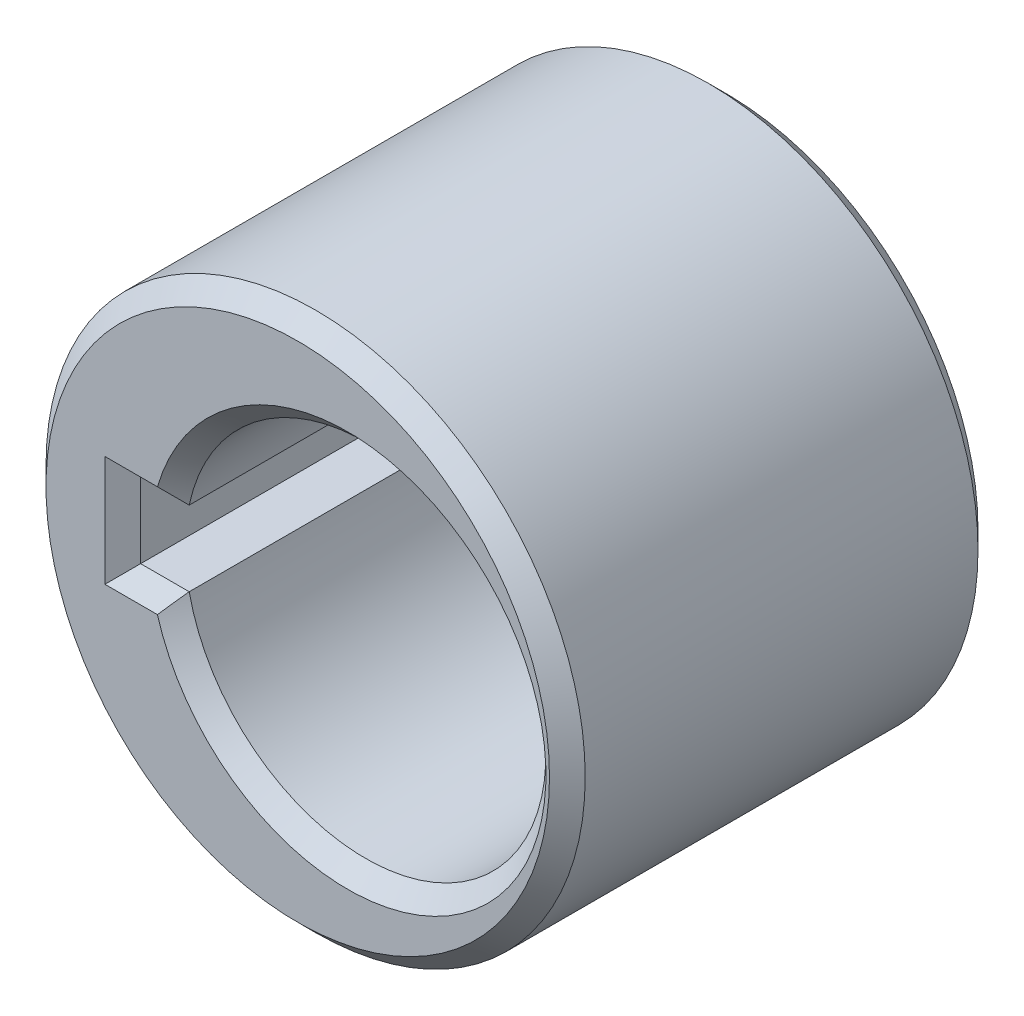
ISO-10303-21;
HEADER;
FILE_DESCRIPTION(('STEP AP214'),'2;1');
FILE_NAME('part.step','',(''),(''),'','','');
FILE_SCHEMA(('AUTOMOTIVE_DESIGN { 1 0 10303 214 1 1 1 1 }'));
ENDSEC;
DATA;
#1=APPLICATION_CONTEXT('core data for automotive mechanical design processes');
#2=APPLICATION_PROTOCOL_DEFINITION('international standard','automotive_design',2000,#1);
#3=PRODUCT_CONTEXT('',#1,'mechanical');
#4=PRODUCT('Part','Part','',(#3));
#5=PRODUCT_RELATED_PRODUCT_CATEGORY('part','',(#4));
#6=PRODUCT_DEFINITION_FORMATION('','',#4);
#7=PRODUCT_DEFINITION_CONTEXT('part definition',#1,'design');
#8=PRODUCT_DEFINITION('design','',#6,#7);
#9=PRODUCT_DEFINITION_SHAPE('','',#8);
#10=(LENGTH_UNIT() NAMED_UNIT(*) SI_UNIT(.MILLI.,.METRE.));
#11=(NAMED_UNIT(*) PLANE_ANGLE_UNIT() SI_UNIT($,.RADIAN.));
#12=(NAMED_UNIT(*) SI_UNIT($,.STERADIAN.) SOLID_ANGLE_UNIT());
#13=UNCERTAINTY_MEASURE_WITH_UNIT(LENGTH_MEASURE(1.E-05),#10,'distance_accuracy_value','');
#14=(GEOMETRIC_REPRESENTATION_CONTEXT(3) GLOBAL_UNCERTAINTY_ASSIGNED_CONTEXT((#13)) GLOBAL_UNIT_ASSIGNED_CONTEXT((#10,
#11,#12)) REPRESENTATION_CONTEXT('',''));
#15=CARTESIAN_POINT('',(0.,0.,0.));
#16=DIRECTION('',(0.,0.,1.));
#17=DIRECTION('',(1.,0.,0.));
#18=AXIS2_PLACEMENT_3D('',#15,#16,#17);
#19=CARTESIAN_POINT('',(-1.4,0.,12.));
#20=DIRECTION('',(0.,0.,1.));
#21=DIRECTION('',(1.,0.,0.));
#22=AXIS2_PLACEMENT_3D('',#19,#20,#21);
#23=PLANE('',#22);
#24=CARTESIAN_POINT('',(-1.4,0.,12.));
#25=DIRECTION('',(0.,0.,1.));
#26=DIRECTION('',(1.,0.,0.));
#27=AXIS2_PLACEMENT_3D('',#24,#25,#26);
#28=CIRCLE('',#27,7.05);
#29=CARTESIAN_POINT('',(5.65,0.,12.));
#30=VERTEX_POINT('',#29);
#31=EDGE_CURVE('E11',#30,#30,#28,.T.);
#32=ORIENTED_EDGE('',*,*,#31,.T.);
#33=EDGE_LOOP('',(#32));
#34=FACE_BOUND('',#33,.T.);
#35=DIRECTION('',(-1.,0.,0.));
#36=VECTOR('',#35,1.);
#37=CARTESIAN_POINT('',(-6.3,-1.55,12.));
#38=LINE('',#37,#36);
#39=CARTESIAN_POINT('',(-5.32916503778969,-1.54999999999999,12.));
#40=VERTEX_POINT('',#39);
#41=CARTESIAN_POINT('',(-6.79999999999999,-1.55,12.));
#42=VERTEX_POINT('',#41);
#43=EDGE_CURVE('E141',#40,#42,#38,.T.);
#44=ORIENTED_EDGE('',*,*,#43,.T.);
#45=DIRECTION('',(0.,1.,0.));
#46=VECTOR('',#45,1.);
#47=CARTESIAN_POINT('',(-6.79999999999999,1.05,12.));
#48=LINE('',#47,#46);
#49=CARTESIAN_POINT('',(-6.79999999999999,1.54999999999999,12.));
#50=VERTEX_POINT('',#49);
#51=EDGE_CURVE('E123',#42,#50,#48,.T.);
#52=ORIENTED_EDGE('',*,*,#51,.T.);
#53=DIRECTION('',(1.,0.,0.));
#54=VECTOR('',#53,1.);
#55=CARTESIAN_POINT('',(-4.93963561409139,1.54999999999999,12.));
#56=LINE('',#55,#54);
#57=CARTESIAN_POINT('',(-5.32916503778969,1.54999999999999,12.));
#58=VERTEX_POINT('',#57);
#59=EDGE_CURVE('E147',#50,#58,#56,.T.);
#60=ORIENTED_EDGE('',*,*,#59,.T.);
#61=CARTESIAN_POINT('',(0.,0.,12.));
#62=DIRECTION('',(0.,0.,1.));
#63=DIRECTION('',(1.,0.,0.));
#64=AXIS2_PLACEMENT_3D('',#61,#62,#63);
#65=CIRCLE('',#64,5.54999999999999);
#66=EDGE_CURVE('E138',#58,#40,#65,.F.);
#67=ORIENTED_EDGE('',*,*,#66,.T.);
#68=EDGE_LOOP('',(#44,#52,#60,#67));
#69=FACE_BOUND('',#68,.T.);
#70=ADVANCED_FACE('F41',(#34,#69),#23,.T.);
#71=CARTESIAN_POINT('',(-1.4,0.,0.));
#72=DIRECTION('',(0.,0.,1.));
#73=DIRECTION('',(1.,0.,0.));
#74=AXIS2_PLACEMENT_3D('',#71,#72,#73);
#75=PLANE('',#74);
#76=CARTESIAN_POINT('',(-1.4,0.,0.));
#77=DIRECTION('',(0.,0.,1.));
#78=DIRECTION('',(1.,0.,0.));
#79=AXIS2_PLACEMENT_3D('',#76,#77,#78);
#80=CIRCLE('',#79,7.04999999999999);
#81=CARTESIAN_POINT('',(5.64999999999999,0.,0.));
#82=VERTEX_POINT('',#81);
#83=EDGE_CURVE('E50',#82,#82,#80,.F.);
#84=ORIENTED_EDGE('',*,*,#83,.T.);
#85=EDGE_LOOP('',(#84));
#86=FACE_BOUND('',#85,.T.);
#87=DIRECTION('',(1.,0.,0.));
#88=VECTOR('',#87,1.);
#89=CARTESIAN_POINT('',(-1.4,-1.55,0.));
#90=LINE('',#89,#88);
#91=CARTESIAN_POINT('',(-6.8,-1.55,0.));
#92=VERTEX_POINT('',#91);
#93=CARTESIAN_POINT('',(-5.32916503778969,-1.55,0.));
#94=VERTEX_POINT('',#93);
#95=EDGE_CURVE('E392',#92,#94,#90,.T.);
#96=ORIENTED_EDGE('',*,*,#95,.T.);
#97=CARTESIAN_POINT('',(0.,0.,0.));
#98=DIRECTION('',(0.,0.,1.));
#99=DIRECTION('',(1.,0.,0.));
#100=AXIS2_PLACEMENT_3D('',#97,#98,#99);
#101=CIRCLE('',#100,5.55);
#102=CARTESIAN_POINT('',(-5.32916503778969,1.55,0.));
#103=VERTEX_POINT('',#102);
#104=EDGE_CURVE('E388',#94,#103,#101,.T.);
#105=ORIENTED_EDGE('',*,*,#104,.T.);
#106=DIRECTION('',(-1.,0.,0.));
#107=VECTOR('',#106,1.);
#108=CARTESIAN_POINT('',(-1.4,1.55,0.));
#109=LINE('',#108,#107);
#110=CARTESIAN_POINT('',(-6.8,1.55,0.));
#111=VERTEX_POINT('',#110);
#112=EDGE_CURVE('E411',#103,#111,#109,.T.);
#113=ORIENTED_EDGE('',*,*,#112,.T.);
#114=DIRECTION('',(0.,-1.,0.));
#115=VECTOR('',#114,1.);
#116=CARTESIAN_POINT('',(-6.8,0.,0.));
#117=LINE('',#116,#115);
#118=EDGE_CURVE('E152',#111,#92,#117,.T.);
#119=ORIENTED_EDGE('',*,*,#118,.T.);
#120=EDGE_LOOP('',(#96,#105,#113,#119));
#121=FACE_BOUND('',#120,.T.);
#122=ADVANCED_FACE('F246',(#86,#121),#75,.F.);
#123=CARTESIAN_POINT('',(-1.4,0.,12.));
#124=DIRECTION('',(0.,0.,-1.));
#125=DIRECTION('',(-1.,0.,0.));
#126=AXIS2_PLACEMENT_3D('',#123,#124,#125);
#127=CYLINDRICAL_SURFACE('',#126,7.55);
#128=CARTESIAN_POINT('',(-1.4,0.,0.500000000000004));
#129=DIRECTION('',(0.,0.,1.));
#130=DIRECTION('',(1.,0.,0.));
#131=AXIS2_PLACEMENT_3D('',#128,#129,#130);
#132=CIRCLE('',#131,7.55);
#133=CARTESIAN_POINT('',(6.15,0.,0.500000000000004));
#134=VERTEX_POINT('',#133);
#135=EDGE_CURVE('E397',#134,#134,#132,.T.);
#136=ORIENTED_EDGE('',*,*,#135,.T.);
#137=EDGE_LOOP('',(#136));
#138=FACE_BOUND('',#137,.T.);
#139=CARTESIAN_POINT('',(-1.4,0.,11.5));
#140=DIRECTION('',(0.,0.,1.));
#141=DIRECTION('',(1.,0.,0.));
#142=AXIS2_PLACEMENT_3D('',#139,#140,#141);
#143=CIRCLE('',#142,7.55);
#144=CARTESIAN_POINT('',(6.15,0.,11.5));
#145=VERTEX_POINT('',#144);
#146=EDGE_CURVE('E395',#145,#145,#143,.F.);
#147=ORIENTED_EDGE('',*,*,#146,.T.);
#148=EDGE_LOOP('',(#147));
#149=FACE_BOUND('',#148,.T.);
#150=ADVANCED_FACE('F252',(#138,#149),#127,.T.);
#151=CARTESIAN_POINT('',(0.,0.,12.));
#152=DIRECTION('',(0.,0.,-1.));
#153=DIRECTION('',(-1.,0.,0.));
#154=AXIS2_PLACEMENT_3D('',#151,#152,#153);
#155=CYLINDRICAL_SURFACE('',#154,5.05);
#156=DIRECTION('',(0.,0.,-1.));
#157=VECTOR('',#156,1.);
#158=CARTESIAN_POINT('',(-4.93963561409139,1.05,12.));
#159=LINE('',#158,#157);
#160=CARTESIAN_POINT('',(-4.93963561409139,1.05,0.500000000000004));
#161=VERTEX_POINT('',#160);
#162=CARTESIAN_POINT('',(-4.93963561409139,1.05,11.5));
#163=VERTEX_POINT('',#162);
#164=EDGE_CURVE('E112',#161,#163,#159,.F.);
#165=ORIENTED_EDGE('',*,*,#164,.F.);
#166=CARTESIAN_POINT('',(0.,0.,0.500000000000004));
#167=DIRECTION('',(0.,0.,1.));
#168=DIRECTION('',(1.,0.,0.));
#169=AXIS2_PLACEMENT_3D('',#166,#167,#168);
#170=CIRCLE('',#169,5.05);
#171=CARTESIAN_POINT('',(-4.93963561409139,-1.05,0.500000000000004));
#172=VERTEX_POINT('',#171);
#173=EDGE_CURVE('E386',#161,#172,#170,.F.);
#174=ORIENTED_EDGE('',*,*,#173,.T.);
#175=DIRECTION('',(0.,0.,-1.));
#176=VECTOR('',#175,1.);
#177=CARTESIAN_POINT('',(-4.93963561409139,-1.05,12.));
#178=LINE('',#177,#176);
#179=CARTESIAN_POINT('',(-4.93963561409139,-1.05,11.5));
#180=VERTEX_POINT('',#179);
#181=EDGE_CURVE('E139',#180,#172,#178,.T.);
#182=ORIENTED_EDGE('',*,*,#181,.F.);
#183=CARTESIAN_POINT('',(0.,0.,11.5));
#184=DIRECTION('',(0.,0.,1.));
#185=DIRECTION('',(1.,0.,0.));
#186=AXIS2_PLACEMENT_3D('',#183,#184,#185);
#187=CIRCLE('',#186,5.05);
#188=EDGE_CURVE('E133',#180,#163,#187,.T.);
#189=ORIENTED_EDGE('',*,*,#188,.T.);
#190=EDGE_LOOP('',(#165,#174,#182,#189));
#191=FACE_BOUND('',#190,.T.);
#192=ADVANCED_FACE('F257',(#191),#155,.F.);
#193=CARTESIAN_POINT('',(0.,-1.05,0.));
#194=DIRECTION('',(0.,-1.,0.));
#195=DIRECTION('',(1.,0.,0.));
#196=AXIS2_PLACEMENT_3D('',#193,#194,#195);
#197=PLANE('',#196);
#198=ORIENTED_EDGE('',*,*,#181,.T.);
#199=DIRECTION('',(-1.,0.,0.));
#200=VECTOR('',#199,1.);
#201=CARTESIAN_POINT('',(0.,-1.05,0.500000000000004));
#202=LINE('',#201,#200);
#203=CARTESIAN_POINT('',(-6.3,-1.05,0.500000000000004));
#204=VERTEX_POINT('',#203);
#205=EDGE_CURVE('E65',#172,#204,#202,.T.);
#206=ORIENTED_EDGE('',*,*,#205,.T.);
#207=DIRECTION('',(0.,0.,1.));
#208=VECTOR('',#207,1.);
#209=CARTESIAN_POINT('',(-6.3,-1.05,0.));
#210=LINE('',#209,#208);
#211=CARTESIAN_POINT('',(-6.3,-1.05,11.5));
#212=VERTEX_POINT('',#211);
#213=EDGE_CURVE('E105',#204,#212,#210,.T.);
#214=ORIENTED_EDGE('',*,*,#213,.T.);
#215=DIRECTION('',(1.,0.,0.));
#216=VECTOR('',#215,1.);
#217=CARTESIAN_POINT('',(-4.93963561409139,-1.05,11.5));
#218=LINE('',#217,#216);
#219=EDGE_CURVE('E109',#212,#180,#218,.T.);
#220=ORIENTED_EDGE('',*,*,#219,.T.);
#221=EDGE_LOOP('',(#198,#206,#214,#220));
#222=FACE_BOUND('',#221,.T.);
#223=ADVANCED_FACE('F107',(#222),#197,.F.);
#224=CARTESIAN_POINT('',(-6.3,1.05,0.));
#225=DIRECTION('',(-1.,0.,0.));
#226=DIRECTION('',(0.,0.,1.));
#227=AXIS2_PLACEMENT_3D('',#224,#225,#226);
#228=PLANE('',#227);
#229=ORIENTED_EDGE('',*,*,#213,.F.);
#230=DIRECTION('',(0.,1.,0.));
#231=VECTOR('',#230,1.);
#232=CARTESIAN_POINT('',(-6.3,1.05,0.500000000000004));
#233=LINE('',#232,#231);
#234=CARTESIAN_POINT('',(-6.3,1.05,0.500000000000004));
#235=VERTEX_POINT('',#234);
#236=EDGE_CURVE('E57',#204,#235,#233,.T.);
#237=ORIENTED_EDGE('',*,*,#236,.T.);
#238=DIRECTION('',(0.,0.,1.));
#239=VECTOR('',#238,1.);
#240=CARTESIAN_POINT('',(-6.3,1.05,0.));
#241=LINE('',#240,#239);
#242=CARTESIAN_POINT('',(-6.3,1.05,11.5));
#243=VERTEX_POINT('',#242);
#244=EDGE_CURVE('E113',#235,#243,#241,.T.);
#245=ORIENTED_EDGE('',*,*,#244,.T.);
#246=DIRECTION('',(0.,-1.,0.));
#247=VECTOR('',#246,1.);
#248=CARTESIAN_POINT('',(-6.3,-1.05,11.5));
#249=LINE('',#248,#247);
#250=EDGE_CURVE('E121',#243,#212,#249,.T.);
#251=ORIENTED_EDGE('',*,*,#250,.T.);
#252=EDGE_LOOP('',(#229,#237,#245,#251));
#253=FACE_BOUND('',#252,.T.);
#254=ADVANCED_FACE('F136',(#253),#228,.F.);
#255=CARTESIAN_POINT('',(0.,1.05,0.));
#256=DIRECTION('',(0.,1.,0.));
#257=DIRECTION('',(-1.,0.,0.));
#258=AXIS2_PLACEMENT_3D('',#255,#256,#257);
#259=PLANE('',#258);
#260=ORIENTED_EDGE('',*,*,#244,.F.);
#261=DIRECTION('',(1.,0.,0.));
#262=VECTOR('',#261,1.);
#263=CARTESIAN_POINT('',(0.,1.05,0.500000000000004));
#264=LINE('',#263,#262);
#265=EDGE_CURVE('E383',#235,#161,#264,.T.);
#266=ORIENTED_EDGE('',*,*,#265,.T.);
#267=ORIENTED_EDGE('',*,*,#164,.T.);
#268=DIRECTION('',(-1.,0.,0.));
#269=VECTOR('',#268,1.);
#270=CARTESIAN_POINT('',(-6.3,1.05,11.5));
#271=LINE('',#270,#269);
#272=EDGE_CURVE('E134',#163,#243,#271,.T.);
#273=ORIENTED_EDGE('',*,*,#272,.T.);
#274=EDGE_LOOP('',(#260,#266,#267,#273));
#275=FACE_BOUND('',#274,.T.);
#276=ADVANCED_FACE('F291',(#275),#259,.F.);
#277=CARTESIAN_POINT('',(0.,0.,11.5));
#278=DIRECTION('',(0.,0.,1.));
#279=DIRECTION('',(1.,0.,0.));
#280=AXIS2_PLACEMENT_3D('',#277,#278,#279);
#281=CONICAL_SURFACE('',#280,5.05,0.785398163397448);
#282=CARTESIAN_POINT('',(-4.93963561409139,-1.05,11.5));
#283=CARTESIAN_POINT('',(-4.97306727438379,-1.09128547069311,11.5412854706931));
#284=CARTESIAN_POINT('',(-5.00624373290036,-1.1326740882986,11.5826740882986));
#285=CARTESIAN_POINT('',(-5.07210348665936,-1.21564357899089,11.6656435789909));
#286=CARTESIAN_POINT('',(-5.10478681344634,-1.25722443955613,11.7072244395561));
#287=CARTESIAN_POINT('',(-5.16968159226311,-1.34056937418892,11.7905693741889));
#288=CARTESIAN_POINT('',(-5.20189304781297,-1.38233344688672,11.8323334468867));
#289=CARTESIAN_POINT('',(-5.26586408278405,-1.46603776209881,11.9160377620988));
#290=CARTESIAN_POINT('',(-5.29762363304361,-1.50797801575798,11.957978015758));
#291=CARTESIAN_POINT('',(-5.32916503779028,-1.54999999999976,11.9999999999998));
#292=B_SPLINE_CURVE_WITH_KNOTS('',3,(#282,#283,#284,#285,#286,#287,#288,#289,#290,#291),
.UNSPECIFIED.,.F.,.F.,(4,2,2,2,4),(0.,0.201840325274072,0.403667684050667,0.605493536465242,
0.807332354265617),.UNSPECIFIED.);
#293=EDGE_CURVE('E132',#40,#180,#292,.F.);
#294=ORIENTED_EDGE('',*,*,#293,.F.);
#295=ORIENTED_EDGE('',*,*,#66,.F.);
#296=CARTESIAN_POINT('',(-5.32916503778971,1.54999999999999,12.));
#297=CARTESIAN_POINT('',(-5.2976236330434,1.50797801575807,11.9579780157581));
#298=CARTESIAN_POINT('',(-5.265864082784,1.46603776209884,11.9160377620989));
#299=CARTESIAN_POINT('',(-5.20189304781304,1.3823334468867,11.8323334468867));
#300=CARTESIAN_POINT('',(-5.16968159226314,1.34056937418891,11.7905693741889));
#301=CARTESIAN_POINT('',(-5.10478681344632,1.25722443955614,11.7072244395561));
#302=CARTESIAN_POINT('',(-5.07210348665933,1.21564357899091,11.6656435789909));
#303=CARTESIAN_POINT('',(-5.0062437329004,1.13267408829859,11.5826740882986));
#304=CARTESIAN_POINT('',(-4.9730672743839,1.09128547069307,11.5412854706931));
#305=CARTESIAN_POINT('',(-4.93963561409164,1.0499999999999,11.4999999999999));
#306=B_SPLINE_CURVE_WITH_KNOTS('',3,(#296,#297,#298,#299,#300,#301,#302,#303,#304,#305),
.UNSPECIFIED.,.F.,.F.,(4,2,2,2,4),(0.,0.20183881780038,0.403664670214961,0.605492028991555,
0.807332354265627),.UNSPECIFIED.);
#307=EDGE_CURVE('E162',#163,#58,#306,.F.);
#308=ORIENTED_EDGE('',*,*,#307,.F.);
#309=ORIENTED_EDGE('',*,*,#188,.F.);
#310=EDGE_LOOP('',(#294,#295,#308,#309));
#311=FACE_BOUND('',#310,.T.);
#312=ADVANCED_FACE('F170',(#311),#281,.F.);
#313=CARTESIAN_POINT('',(0.,1.05,11.5));
#314=DIRECTION('',(0.,-0.707106781186547,0.707106781186547));
#315=DIRECTION('',(1.,0.,0.));
#316=AXIS2_PLACEMENT_3D('',#313,#314,#315);
#317=PLANE('',#316);
#318=ORIENTED_EDGE('',*,*,#307,.T.);
#319=ORIENTED_EDGE('',*,*,#59,.F.);
#320=DIRECTION('',(0.577350269189626,-0.577350269189626,-0.577350269189626));
#321=VECTOR('',#320,1.);
#322=CARTESIAN_POINT('',(-6.3,1.05,11.5));
#323=LINE('',#322,#321);
#324=EDGE_CURVE('E126',#243,#50,#323,.F.);
#325=ORIENTED_EDGE('',*,*,#324,.F.);
#326=ORIENTED_EDGE('',*,*,#272,.F.);
#327=EDGE_LOOP('',(#318,#319,#325,#326));
#328=FACE_BOUND('',#327,.T.);
#329=ADVANCED_FACE('F179',(#328),#317,.T.);
#330=CARTESIAN_POINT('',(0.,-1.05,11.5));
#331=DIRECTION('',(0.,0.707106781186547,0.707106781186547));
#332=DIRECTION('',(-1.,0.,0.));
#333=AXIS2_PLACEMENT_3D('',#330,#331,#332);
#334=PLANE('',#333);
#335=ORIENTED_EDGE('',*,*,#293,.T.);
#336=ORIENTED_EDGE('',*,*,#219,.F.);
#337=DIRECTION('',(-0.577350269189626,-0.577350269189626,0.577350269189626));
#338=VECTOR('',#337,1.);
#339=CARTESIAN_POINT('',(-5.6,-0.350000000000002,10.8));
#340=LINE('',#339,#338);
#341=EDGE_CURVE('E119',#42,#212,#340,.F.);
#342=ORIENTED_EDGE('',*,*,#341,.F.);
#343=ORIENTED_EDGE('',*,*,#43,.F.);
#344=EDGE_LOOP('',(#335,#336,#342,#343));
#345=FACE_BOUND('',#344,.T.);
#346=ADVANCED_FACE('F130',(#345),#334,.T.);
#347=CARTESIAN_POINT('',(-6.3,1.05,11.5));
#348=DIRECTION('',(0.707106781186547,0.,0.707106781186547));
#349=DIRECTION('',(0.,1.,0.));
#350=AXIS2_PLACEMENT_3D('',#347,#348,#349);
#351=PLANE('',#350);
#352=ORIENTED_EDGE('',*,*,#324,.T.);
#353=ORIENTED_EDGE('',*,*,#51,.F.);
#354=ORIENTED_EDGE('',*,*,#341,.T.);
#355=ORIENTED_EDGE('',*,*,#250,.F.);
#356=EDGE_LOOP('',(#352,#353,#354,#355));
#357=FACE_BOUND('',#356,.T.);
#358=ADVANCED_FACE('F120',(#357),#351,.T.);
#359=CARTESIAN_POINT('',(-6.8,0.,0.));
#360=DIRECTION('',(-0.70710678118655,0.,0.707106781186545));
#361=DIRECTION('',(0.,-1.,0.));
#362=AXIS2_PLACEMENT_3D('',#359,#360,#361);
#363=PLANE('',#362);
#364=DIRECTION('',(0.577350269189625,-0.577350269189624,0.577350269189629));
#365=VECTOR('',#364,1.);
#366=CARTESIAN_POINT('',(-5.00000000000001,-0.249999999999992,1.8));
#367=LINE('',#366,#365);
#368=EDGE_CURVE('E215',#235,#111,#367,.F.);
#369=ORIENTED_EDGE('',*,*,#368,.F.);
#370=ORIENTED_EDGE('',*,*,#236,.F.);
#371=DIRECTION('',(-0.577350269189624,-0.577350269189625,-0.577350269189628));
#372=VECTOR('',#371,1.);
#373=CARTESIAN_POINT('',(-5.00000000000001,0.24999999999999,1.8));
#374=LINE('',#373,#372);
#375=EDGE_CURVE('E127',#92,#204,#374,.F.);
#376=ORIENTED_EDGE('',*,*,#375,.F.);
#377=ORIENTED_EDGE('',*,*,#118,.F.);
#378=EDGE_LOOP('',(#369,#370,#376,#377));
#379=FACE_BOUND('',#378,.T.);
#380=ADVANCED_FACE('F224',(#379),#363,.F.);
#381=CARTESIAN_POINT('',(-1.4,-1.55,0.));
#382=DIRECTION('',(0.,-0.70710678118655,0.707106781186545));
#383=DIRECTION('',(1.,0.,0.));
#384=AXIS2_PLACEMENT_3D('',#381,#382,#383);
#385=PLANE('',#384);
#386=ORIENTED_EDGE('',*,*,#375,.T.);
#387=ORIENTED_EDGE('',*,*,#205,.F.);
#388=CARTESIAN_POINT('',(-4.93963561409139,-1.05,0.500000000000004));
#389=CARTESIAN_POINT('',(-4.97306727438379,-1.09128547069311,0.458714529306896));
#390=CARTESIAN_POINT('',(-5.00624373290036,-1.1326740882986,0.417325911701403));
#391=CARTESIAN_POINT('',(-5.07210348665936,-1.21564357899089,0.33435642100911));
#392=CARTESIAN_POINT('',(-5.10478681344634,-1.25722443955613,0.292775560443874));
#393=CARTESIAN_POINT('',(-5.16968159226311,-1.34056937418892,0.209430625811085));
#394=CARTESIAN_POINT('',(-5.20189304781297,-1.38233344688672,0.167666553113284));
#395=CARTESIAN_POINT('',(-5.26586408278405,-1.46603776209881,0.0839622379011901));
#396=CARTESIAN_POINT('',(-5.29762363304361,-1.50797801575798,0.0420219842420199));
#397=CARTESIAN_POINT('',(-5.32916503779028,-1.54999999999976,2.39508403908769E-13));
#398=B_SPLINE_CURVE_WITH_KNOTS('',3,(#388,#389,#390,#391,#392,#393,#394,#395,#396,#397),
.UNSPECIFIED.,.F.,.F.,(4,2,2,2,4),(0.,0.201840325274072,0.403667684050667,0.605493536465243,
0.807332354265617),.UNSPECIFIED.);
#399=EDGE_CURVE('E208',#94,#172,#398,.F.);
#400=ORIENTED_EDGE('',*,*,#399,.F.);
#401=ORIENTED_EDGE('',*,*,#95,.F.);
#402=EDGE_LOOP('',(#386,#387,#400,#401));
#403=FACE_BOUND('',#402,.T.);
#404=ADVANCED_FACE('F196',(#403),#385,.F.);
#405=CARTESIAN_POINT('',(-1.4,1.55,0.));
#406=DIRECTION('',(0.,0.70710678118655,0.707106781186545));
#407=DIRECTION('',(-1.,0.,0.));
#408=AXIS2_PLACEMENT_3D('',#405,#406,#407);
#409=PLANE('',#408);
#410=ORIENTED_EDGE('',*,*,#368,.T.);
#411=ORIENTED_EDGE('',*,*,#112,.F.);
#412=CARTESIAN_POINT('',(-5.32916503778969,1.54999999999999,0.));
#413=CARTESIAN_POINT('',(-5.2976236330434,1.50797801575807,0.0420219842419246));
#414=CARTESIAN_POINT('',(-5.265864082784,1.46603776209884,0.0839622379011574));
#415=CARTESIAN_POINT('',(-5.20189304781304,1.3823334468867,0.167666553113301));
#416=CARTESIAN_POINT('',(-5.16968159226314,1.34056937418891,0.209430625811089));
#417=CARTESIAN_POINT('',(-5.10478681344632,1.25722443955614,0.29277556044386));
#418=CARTESIAN_POINT('',(-5.07210348665933,1.21564357899091,0.334356421009092));
#419=CARTESIAN_POINT('',(-5.0062437329004,1.13267408829859,0.417325911701411));
#420=CARTESIAN_POINT('',(-4.9730672743839,1.09128547069307,0.458714529306934));
#421=CARTESIAN_POINT('',(-4.93963561409164,1.0499999999999,0.500000000000099));
#422=B_SPLINE_CURVE_WITH_KNOTS('',3,(#412,#413,#414,#415,#416,#417,#418,#419,#420,#421),
.UNSPECIFIED.,.F.,.F.,(4,2,2,2,4),(0.,0.20183881780038,0.403664670214961,0.605492028991556,
0.807332354265628),.UNSPECIFIED.);
#423=EDGE_CURVE('E201',#161,#103,#422,.F.);
#424=ORIENTED_EDGE('',*,*,#423,.F.);
#425=ORIENTED_EDGE('',*,*,#265,.F.);
#426=EDGE_LOOP('',(#410,#411,#424,#425));
#427=FACE_BOUND('',#426,.T.);
#428=ADVANCED_FACE('F187',(#427),#409,.F.);
#429=CARTESIAN_POINT('',(0.,0.,0.));
#430=DIRECTION('',(0.,0.,-1.));
#431=DIRECTION('',(-1.,0.,0.));
#432=AXIS2_PLACEMENT_3D('',#429,#430,#431);
#433=CONICAL_SURFACE('',#432,5.55,0.785398163397445);
#434=ORIENTED_EDGE('',*,*,#399,.T.);
#435=ORIENTED_EDGE('',*,*,#173,.F.);
#436=ORIENTED_EDGE('',*,*,#423,.T.);
#437=ORIENTED_EDGE('',*,*,#104,.F.);
#438=EDGE_LOOP('',(#434,#435,#436,#437));
#439=FACE_BOUND('',#438,.T.);
#440=ADVANCED_FACE('F195',(#439),#433,.F.);
#441=CARTESIAN_POINT('',(-1.4,0.,0.500000000000004));
#442=DIRECTION('',(0.,0.,1.));
#443=DIRECTION('',(1.,0.,0.));
#444=AXIS2_PLACEMENT_3D('',#441,#442,#443);
#445=CONICAL_SURFACE('',#444,7.55,0.78539816339745);
#446=ORIENTED_EDGE('',*,*,#83,.F.);
#447=EDGE_LOOP('',(#446));
#448=FACE_BOUND('',#447,.T.);
#449=ORIENTED_EDGE('',*,*,#135,.F.);
#450=EDGE_LOOP('',(#449));
#451=FACE_BOUND('',#450,.T.);
#452=ADVANCED_FACE('F231',(#448,#451),#445,.T.);
#453=CARTESIAN_POINT('',(-1.4,0.,12.));
#454=DIRECTION('',(0.,0.,-1.));
#455=DIRECTION('',(-1.,0.,0.));
#456=AXIS2_PLACEMENT_3D('',#453,#454,#455);
#457=CONICAL_SURFACE('',#456,7.05,0.785398163397443);
#458=ORIENTED_EDGE('',*,*,#146,.F.);
#459=EDGE_LOOP('',(#458));
#460=FACE_BOUND('',#459,.T.);
#461=ORIENTED_EDGE('',*,*,#31,.F.);
#462=EDGE_LOOP('',(#461));
#463=FACE_BOUND('',#462,.T.);
#464=ADVANCED_FACE('F44',(#460,#463),#457,.T.);
#465=CLOSED_SHELL('',(#70,#122,#150,#192,#223,#254,#276,#312,#329,#346,#358,#380,#404,#428,#440,
#452,#464));
#466=MANIFOLD_SOLID_BREP('B2',#465);
#467=ADVANCED_BREP_SHAPE_REPRESENTATION('',(#18,#466),#14);
#468=SHAPE_DEFINITION_REPRESENTATION(#9,#467);
ENDSEC;
END-ISO-10303-21;
